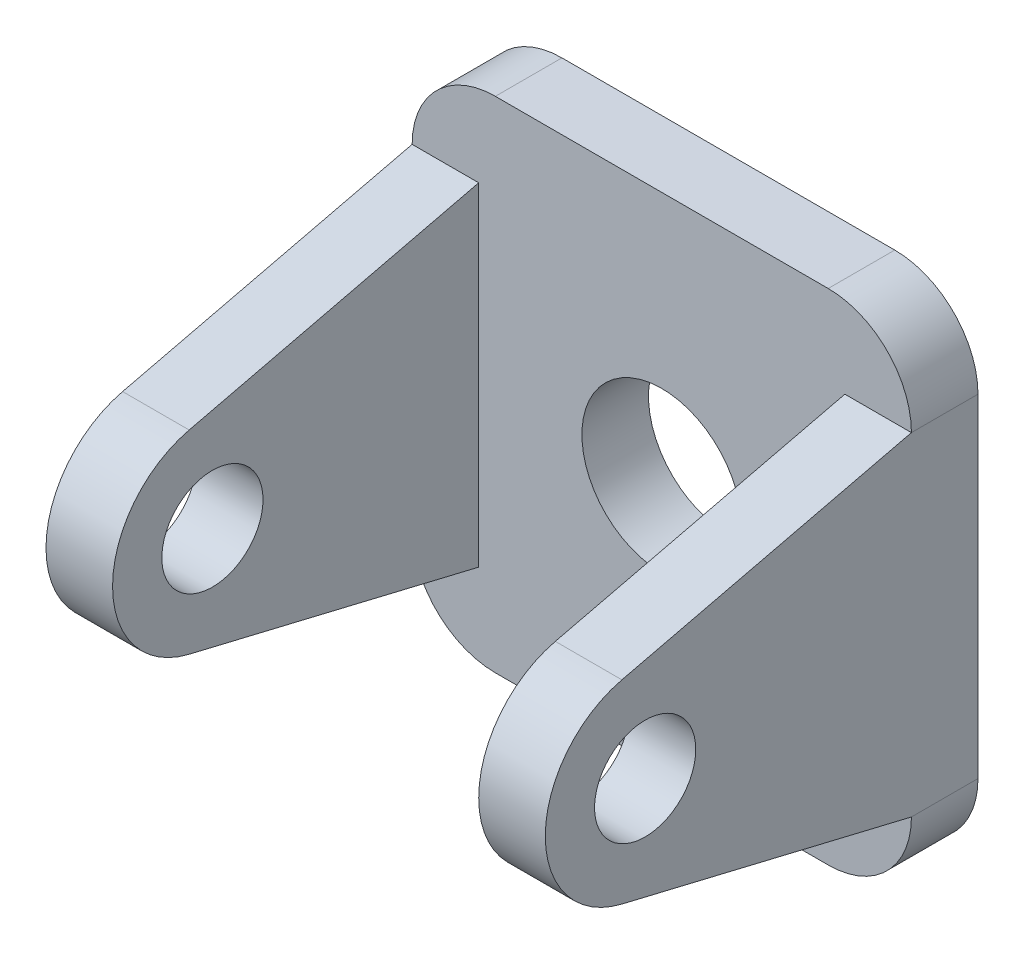
ISO-10303-21;
HEADER;
FILE_DESCRIPTION(('STEP AP214'),'2;1');
FILE_NAME('part.step','',(''),(''),'','','');
FILE_SCHEMA(('AUTOMOTIVE_DESIGN { 1 0 10303 214 1 1 1 1 }'));
ENDSEC;
DATA;
#1=APPLICATION_CONTEXT('core data for automotive mechanical design processes');
#2=APPLICATION_PROTOCOL_DEFINITION('international standard','automotive_design',2000,#1);
#3=PRODUCT_CONTEXT('',#1,'mechanical');
#4=PRODUCT('Part','Part','',(#3));
#5=PRODUCT_RELATED_PRODUCT_CATEGORY('part','',(#4));
#6=PRODUCT_DEFINITION_FORMATION('','',#4);
#7=PRODUCT_DEFINITION_CONTEXT('part definition',#1,'design');
#8=PRODUCT_DEFINITION('design','',#6,#7);
#9=PRODUCT_DEFINITION_SHAPE('','',#8);
#10=(LENGTH_UNIT() NAMED_UNIT(*) SI_UNIT(.MILLI.,.METRE.));
#11=(NAMED_UNIT(*) PLANE_ANGLE_UNIT() SI_UNIT($,.RADIAN.));
#12=(NAMED_UNIT(*) SI_UNIT($,.STERADIAN.) SOLID_ANGLE_UNIT());
#13=UNCERTAINTY_MEASURE_WITH_UNIT(LENGTH_MEASURE(1.E-05),#10,'distance_accuracy_value','');
#14=(GEOMETRIC_REPRESENTATION_CONTEXT(3) GLOBAL_UNCERTAINTY_ASSIGNED_CONTEXT((#13)) GLOBAL_UNIT_ASSIGNED_CONTEXT((#10,
#11,#12)) REPRESENTATION_CONTEXT('',''));
#15=CARTESIAN_POINT('',(0.,0.,0.));
#16=DIRECTION('',(0.,0.,1.));
#17=DIRECTION('',(1.,0.,0.));
#18=AXIS2_PLACEMENT_3D('',#15,#16,#17);
#19=CARTESIAN_POINT('',(25.,-25.,10.));
#20=DIRECTION('',(0.,0.,-1.));
#21=DIRECTION('',(-1.,0.,0.));
#22=AXIS2_PLACEMENT_3D('',#19,#20,#21);
#23=PLANE('',#22);
#24=CARTESIAN_POINT('',(0.,0.,10.));
#25=DIRECTION('',(0.,0.,1.));
#26=DIRECTION('',(1.,0.,0.));
#27=AXIS2_PLACEMENT_3D('',#24,#25,#26);
#28=CIRCLE('',#27,12.);
#29=CARTESIAN_POINT('',(12.,0.,10.));
#30=VERTEX_POINT('',#29);
#31=EDGE_CURVE('E577',#30,#30,#28,.T.);
#32=ORIENTED_EDGE('',*,*,#31,.F.);
#33=EDGE_LOOP('',(#32));
#34=FACE_BOUND('',#33,.T.);
#35=DIRECTION('',(-1.,0.,0.));
#36=VECTOR('',#35,1.);
#37=CARTESIAN_POINT('',(-27.5,24.9999999999999,10.));
#38=LINE('',#37,#36);
#39=CARTESIAN_POINT('',(-27.5,24.9999999999999,10.));
#40=VERTEX_POINT('',#39);
#41=CARTESIAN_POINT('',(-37.5,24.9999999999999,10.));
#42=VERTEX_POINT('',#41);
#43=EDGE_CURVE('E60',#40,#42,#38,.T.);
#44=ORIENTED_EDGE('',*,*,#43,.F.);
#45=DIRECTION('',(0.,-1.,0.));
#46=VECTOR('',#45,1.);
#47=CARTESIAN_POINT('',(-27.5,0.,10.));
#48=LINE('',#47,#46);
#49=CARTESIAN_POINT('',(-27.5,-24.9999999999999,10.));
#50=VERTEX_POINT('',#49);
#51=EDGE_CURVE('E65',#40,#50,#48,.T.);
#52=ORIENTED_EDGE('',*,*,#51,.T.);
#53=DIRECTION('',(-1.,0.,0.));
#54=VECTOR('',#53,1.);
#55=CARTESIAN_POINT('',(-27.5,-24.9999999999999,10.));
#56=LINE('',#55,#54);
#57=CARTESIAN_POINT('',(-37.5,-24.9999999999999,10.));
#58=VERTEX_POINT('',#57);
#59=EDGE_CURVE('E168',#50,#58,#56,.T.);
#60=ORIENTED_EDGE('',*,*,#59,.T.);
#61=CARTESIAN_POINT('',(-25.,-25.,10.));
#62=DIRECTION('',(0.,0.,1.));
#63=DIRECTION('',(-1.,0.,0.));
#64=AXIS2_PLACEMENT_3D('',#61,#62,#63);
#65=CIRCLE('',#64,12.5);
#66=CARTESIAN_POINT('',(-24.9999999999999,-37.5,10.));
#67=VERTEX_POINT('',#66);
#68=EDGE_CURVE('E262',#58,#67,#65,.T.);
#69=ORIENTED_EDGE('',*,*,#68,.T.);
#70=DIRECTION('',(1.,0.,0.));
#71=VECTOR('',#70,1.);
#72=CARTESIAN_POINT('',(24.9999999999999,-37.5,10.));
#73=LINE('',#72,#71);
#74=CARTESIAN_POINT('',(24.9999999999999,-37.5,10.));
#75=VERTEX_POINT('',#74);
#76=EDGE_CURVE('E265',#67,#75,#73,.T.);
#77=ORIENTED_EDGE('',*,*,#76,.T.);
#78=CARTESIAN_POINT('',(25.,-25.,10.));
#79=DIRECTION('',(0.,0.,1.));
#80=DIRECTION('',(-1.,0.,0.));
#81=AXIS2_PLACEMENT_3D('',#78,#79,#80);
#82=CIRCLE('',#81,12.5);
#83=CARTESIAN_POINT('',(37.5,-24.9999999999999,10.));
#84=VERTEX_POINT('',#83);
#85=EDGE_CURVE('E248',#75,#84,#82,.T.);
#86=ORIENTED_EDGE('',*,*,#85,.T.);
#87=DIRECTION('',(1.,0.,0.));
#88=VECTOR('',#87,1.);
#89=CARTESIAN_POINT('',(27.5,-24.9999999999999,10.));
#90=LINE('',#89,#88);
#91=CARTESIAN_POINT('',(27.5,-24.9999999999999,10.));
#92=VERTEX_POINT('',#91);
#93=EDGE_CURVE('E240',#92,#84,#90,.T.);
#94=ORIENTED_EDGE('',*,*,#93,.F.);
#95=DIRECTION('',(0.,-1.,0.));
#96=VECTOR('',#95,1.);
#97=CARTESIAN_POINT('',(27.5,0.,10.));
#98=LINE('',#97,#96);
#99=CARTESIAN_POINT('',(27.5,24.9999999999999,10.));
#100=VERTEX_POINT('',#99);
#101=EDGE_CURVE('E213',#100,#92,#98,.T.);
#102=ORIENTED_EDGE('',*,*,#101,.F.);
#103=DIRECTION('',(1.,0.,0.));
#104=VECTOR('',#103,1.);
#105=CARTESIAN_POINT('',(27.5,24.9999999999999,10.));
#106=LINE('',#105,#104);
#107=CARTESIAN_POINT('',(37.5,24.9999999999999,10.));
#108=VERTEX_POINT('',#107);
#109=EDGE_CURVE('E235',#100,#108,#106,.T.);
#110=ORIENTED_EDGE('',*,*,#109,.T.);
#111=CARTESIAN_POINT('',(25.,25.,10.));
#112=DIRECTION('',(0.,0.,1.));
#113=DIRECTION('',(1.,0.,0.));
#114=AXIS2_PLACEMENT_3D('',#111,#112,#113);
#115=CIRCLE('',#114,12.5);
#116=CARTESIAN_POINT('',(24.9999999999999,37.5,10.));
#117=VERTEX_POINT('',#116);
#118=EDGE_CURVE('E252',#108,#117,#115,.T.);
#119=ORIENTED_EDGE('',*,*,#118,.T.);
#120=DIRECTION('',(-1.,0.,0.));
#121=VECTOR('',#120,1.);
#122=CARTESIAN_POINT('',(24.9999999999999,37.5,10.));
#123=LINE('',#122,#121);
#124=CARTESIAN_POINT('',(-24.9999999999999,37.5,10.));
#125=VERTEX_POINT('',#124);
#126=EDGE_CURVE('E256',#117,#125,#123,.T.);
#127=ORIENTED_EDGE('',*,*,#126,.T.);
#128=CARTESIAN_POINT('',(-25.,25.,10.));
#129=DIRECTION('',(0.,0.,1.));
#130=DIRECTION('',(-1.,0.,0.));
#131=AXIS2_PLACEMENT_3D('',#128,#129,#130);
#132=CIRCLE('',#131,12.5);
#133=EDGE_CURVE('E259',#125,#42,#132,.T.);
#134=ORIENTED_EDGE('',*,*,#133,.T.);
#135=EDGE_LOOP('',(#44,#52,#60,#69,#77,#86,#94,#102,#110,#119,#127,#134));
#136=FACE_BOUND('',#135,.T.);
#137=ADVANCED_FACE('F44',(#34,#136),#23,.F.);
#138=CARTESIAN_POINT('',(25.,-25.,10.));
#139=DIRECTION('',(0.,0.,-1.));
#140=DIRECTION('',(-1.,0.,0.));
#141=AXIS2_PLACEMENT_3D('',#138,#139,#140);
#142=CYLINDRICAL_SURFACE('',#141,12.5);
#143=CARTESIAN_POINT('',(25.,-25.,0.));
#144=DIRECTION('',(0.,0.,1.));
#145=DIRECTION('',(-1.,0.,0.));
#146=AXIS2_PLACEMENT_3D('',#143,#144,#145);
#147=CIRCLE('',#146,12.5);
#148=CARTESIAN_POINT('',(24.9999999999999,-37.5,0.));
#149=VERTEX_POINT('',#148);
#150=CARTESIAN_POINT('',(37.5,-24.9999999999999,0.));
#151=VERTEX_POINT('',#150);
#152=EDGE_CURVE('E239',#149,#151,#147,.T.);
#153=ORIENTED_EDGE('',*,*,#152,.T.);
#154=DIRECTION('',(0.,0.,-1.));
#155=VECTOR('',#154,1.);
#156=CARTESIAN_POINT('',(37.5,-24.9999999999999,10.));
#157=LINE('',#156,#155);
#158=EDGE_CURVE('E11',#84,#151,#157,.T.);
#159=ORIENTED_EDGE('',*,*,#158,.F.);
#160=ORIENTED_EDGE('',*,*,#85,.F.);
#161=DIRECTION('',(0.,0.,-1.));
#162=VECTOR('',#161,1.);
#163=CARTESIAN_POINT('',(24.9999999999999,-37.5,10.));
#164=LINE('',#163,#162);
#165=EDGE_CURVE('E268',#75,#149,#164,.T.);
#166=ORIENTED_EDGE('',*,*,#165,.T.);
#167=EDGE_LOOP('',(#153,#159,#160,#166));
#168=FACE_BOUND('',#167,.T.);
#169=ADVANCED_FACE('F46',(#168),#142,.T.);
#170=CARTESIAN_POINT('',(37.5,-24.9999999999999,10.));
#171=DIRECTION('',(-1.,0.,0.));
#172=DIRECTION('',(0.,0.,1.));
#173=AXIS2_PLACEMENT_3D('',#170,#171,#172);
#174=PLANE('',#173);
#175=DIRECTION('',(0.,1.,0.));
#176=VECTOR('',#175,1.);
#177=CARTESIAN_POINT('',(37.5,-24.9999999999999,0.));
#178=LINE('',#177,#176);
#179=CARTESIAN_POINT('',(37.5,24.9999999999999,0.));
#180=VERTEX_POINT('',#179);
#181=EDGE_CURVE('E272',#151,#180,#178,.T.);
#182=ORIENTED_EDGE('',*,*,#181,.T.);
#183=DIRECTION('',(0.,0.,-1.));
#184=VECTOR('',#183,1.);
#185=CARTESIAN_POINT('',(37.5,24.9999999999999,10.));
#186=LINE('',#185,#184);
#187=EDGE_CURVE('E53',#108,#180,#186,.T.);
#188=ORIENTED_EDGE('',*,*,#187,.F.);
#189=DIRECTION('',(0.,-0.232824264606692,0.972518823370711));
#190=VECTOR('',#189,1.);
#191=CARTESIAN_POINT('',(37.5,25.9090813439333,6.20272087858274));
#192=LINE('',#191,#190);
#193=CARTESIAN_POINT('',(37.5,14.5877823505607,53.4923639691004));
#194=VERTEX_POINT('',#193);
#195=EDGE_CURVE('E195',#108,#194,#192,.T.);
#196=ORIENTED_EDGE('',*,*,#195,.T.);
#197=CARTESIAN_POINT('',(37.5,0.,50.));
#198=DIRECTION('',(1.,0.,0.));
#199=DIRECTION('',(0.,0.,-1.));
#200=AXIS2_PLACEMENT_3D('',#197,#198,#199);
#201=CIRCLE('',#200,15.);
#202=CARTESIAN_POINT('',(37.5,-14.5877823505607,53.4923639691004));
#203=VERTEX_POINT('',#202);
#204=EDGE_CURVE('E224',#194,#203,#201,.T.);
#205=ORIENTED_EDGE('',*,*,#204,.T.);
#206=DIRECTION('',(0.,0.232824264606693,0.972518823370711));
#207=VECTOR('',#206,1.);
#208=CARTESIAN_POINT('',(37.5,-25.9090813439333,6.20272087858275));
#209=LINE('',#208,#207);
#210=EDGE_CURVE('E228',#84,#203,#209,.T.);
#211=ORIENTED_EDGE('',*,*,#210,.F.);
#212=ORIENTED_EDGE('',*,*,#158,.T.);
#213=EDGE_LOOP('',(#182,#188,#196,#205,#211,#212));
#214=FACE_BOUND('',#213,.T.);
#215=CARTESIAN_POINT('',(37.5,0.,50.));
#216=DIRECTION('',(1.,0.,0.));
#217=DIRECTION('',(0.,0.,-1.));
#218=AXIS2_PLACEMENT_3D('',#215,#216,#217);
#219=CIRCLE('',#218,7.6);
#220=CARTESIAN_POINT('',(37.5,0.,42.4));
#221=VERTEX_POINT('',#220);
#222=EDGE_CURVE('E206',#221,#221,#219,.T.);
#223=ORIENTED_EDGE('',*,*,#222,.F.);
#224=EDGE_LOOP('',(#223));
#225=FACE_BOUND('',#224,.T.);
#226=ADVANCED_FACE('F352',(#214,#225),#174,.F.);
#227=CARTESIAN_POINT('',(25.,25.,10.));
#228=DIRECTION('',(0.,0.,-1.));
#229=DIRECTION('',(-1.,0.,0.));
#230=AXIS2_PLACEMENT_3D('',#227,#228,#229);
#231=CYLINDRICAL_SURFACE('',#230,12.5);
#232=CARTESIAN_POINT('',(25.,25.,0.));
#233=DIRECTION('',(0.,0.,1.));
#234=DIRECTION('',(1.,0.,0.));
#235=AXIS2_PLACEMENT_3D('',#232,#233,#234);
#236=CIRCLE('',#235,12.5);
#237=CARTESIAN_POINT('',(24.9999999999999,37.5,0.));
#238=VERTEX_POINT('',#237);
#239=EDGE_CURVE('E275',#180,#238,#236,.T.);
#240=ORIENTED_EDGE('',*,*,#239,.T.);
#241=DIRECTION('',(0.,0.,-1.));
#242=VECTOR('',#241,1.);
#243=CARTESIAN_POINT('',(24.9999999999999,37.5,10.));
#244=LINE('',#243,#242);
#245=EDGE_CURVE('E311',#117,#238,#244,.T.);
#246=ORIENTED_EDGE('',*,*,#245,.F.);
#247=ORIENTED_EDGE('',*,*,#118,.F.);
#248=ORIENTED_EDGE('',*,*,#187,.T.);
#249=EDGE_LOOP('',(#240,#246,#247,#248));
#250=FACE_BOUND('',#249,.T.);
#251=ADVANCED_FACE('F320',(#250),#231,.T.);
#252=CARTESIAN_POINT('',(24.9999999999999,37.5,10.));
#253=DIRECTION('',(0.,-1.,0.));
#254=DIRECTION('',(0.,0.,-1.));
#255=AXIS2_PLACEMENT_3D('',#252,#253,#254);
#256=PLANE('',#255);
#257=DIRECTION('',(-1.,0.,0.));
#258=VECTOR('',#257,1.);
#259=CARTESIAN_POINT('',(24.9999999999999,37.5,0.));
#260=LINE('',#259,#258);
#261=CARTESIAN_POINT('',(-24.9999999999999,37.5,0.));
#262=VERTEX_POINT('',#261);
#263=EDGE_CURVE('E278',#238,#262,#260,.T.);
#264=ORIENTED_EDGE('',*,*,#263,.T.);
#265=DIRECTION('',(0.,0.,-1.));
#266=VECTOR('',#265,1.);
#267=CARTESIAN_POINT('',(-24.9999999999999,37.5,10.));
#268=LINE('',#267,#266);
#269=EDGE_CURVE('E307',#125,#262,#268,.T.);
#270=ORIENTED_EDGE('',*,*,#269,.F.);
#271=ORIENTED_EDGE('',*,*,#126,.F.);
#272=ORIENTED_EDGE('',*,*,#245,.T.);
#273=EDGE_LOOP('',(#264,#270,#271,#272));
#274=FACE_BOUND('',#273,.T.);
#275=ADVANCED_FACE('F331',(#274),#256,.F.);
#276=CARTESIAN_POINT('',(-25.,25.,10.));
#277=DIRECTION('',(0.,0.,-1.));
#278=DIRECTION('',(-1.,0.,0.));
#279=AXIS2_PLACEMENT_3D('',#276,#277,#278);
#280=CYLINDRICAL_SURFACE('',#279,12.5);
#281=CARTESIAN_POINT('',(-25.,25.,0.));
#282=DIRECTION('',(0.,0.,1.));
#283=DIRECTION('',(-1.,0.,0.));
#284=AXIS2_PLACEMENT_3D('',#281,#282,#283);
#285=CIRCLE('',#284,12.5);
#286=CARTESIAN_POINT('',(-37.5,24.9999999999999,0.));
#287=VERTEX_POINT('',#286);
#288=EDGE_CURVE('E281',#262,#287,#285,.T.);
#289=ORIENTED_EDGE('',*,*,#288,.T.);
#290=DIRECTION('',(0.,0.,-1.));
#291=VECTOR('',#290,1.);
#292=CARTESIAN_POINT('',(-37.5,24.9999999999999,10.));
#293=LINE('',#292,#291);
#294=EDGE_CURVE('E303',#42,#287,#293,.T.);
#295=ORIENTED_EDGE('',*,*,#294,.F.);
#296=ORIENTED_EDGE('',*,*,#133,.F.);
#297=ORIENTED_EDGE('',*,*,#269,.T.);
#298=EDGE_LOOP('',(#289,#295,#296,#297));
#299=FACE_BOUND('',#298,.T.);
#300=ADVANCED_FACE('F335',(#299),#280,.T.);
#301=CARTESIAN_POINT('',(-37.5,-24.9999999999999,10.));
#302=DIRECTION('',(1.,0.,0.));
#303=DIRECTION('',(0.,0.,-1.));
#304=AXIS2_PLACEMENT_3D('',#301,#302,#303);
#305=PLANE('',#304);
#306=DIRECTION('',(0.,-1.,0.));
#307=VECTOR('',#306,1.);
#308=CARTESIAN_POINT('',(-37.5,-24.9999999999999,0.));
#309=LINE('',#308,#307);
#310=CARTESIAN_POINT('',(-37.5,-24.9999999999999,0.));
#311=VERTEX_POINT('',#310);
#312=EDGE_CURVE('E284',#287,#311,#309,.T.);
#313=ORIENTED_EDGE('',*,*,#312,.T.);
#314=DIRECTION('',(0.,0.,-1.));
#315=VECTOR('',#314,1.);
#316=CARTESIAN_POINT('',(-37.5,-24.9999999999999,10.));
#317=LINE('',#316,#315);
#318=EDGE_CURVE('E299',#58,#311,#317,.T.);
#319=ORIENTED_EDGE('',*,*,#318,.F.);
#320=DIRECTION('',(0.,0.232824264606693,0.972518823370711));
#321=VECTOR('',#320,1.);
#322=CARTESIAN_POINT('',(-37.5,-25.9090813439333,6.20272087858275));
#323=LINE('',#322,#321);
#324=CARTESIAN_POINT('',(-37.5,-14.5877823505607,53.4923639691004));
#325=VERTEX_POINT('',#324);
#326=EDGE_CURVE('E184',#58,#325,#323,.T.);
#327=ORIENTED_EDGE('',*,*,#326,.T.);
#328=CARTESIAN_POINT('',(-37.5,0.,50.));
#329=DIRECTION('',(1.,0.,0.));
#330=DIRECTION('',(0.,0.,-1.));
#331=AXIS2_PLACEMENT_3D('',#328,#329,#330);
#332=CIRCLE('',#331,15.);
#333=CARTESIAN_POINT('',(-37.5,14.5877823505607,53.4923639691004));
#334=VERTEX_POINT('',#333);
#335=EDGE_CURVE('E162',#334,#325,#332,.T.);
#336=ORIENTED_EDGE('',*,*,#335,.F.);
#337=DIRECTION('',(0.,-0.232824264606692,0.972518823370711));
#338=VECTOR('',#337,1.);
#339=CARTESIAN_POINT('',(-37.5,25.9090813439333,6.20272087858274));
#340=LINE('',#339,#338);
#341=EDGE_CURVE('E180',#42,#334,#340,.T.);
#342=ORIENTED_EDGE('',*,*,#341,.F.);
#343=ORIENTED_EDGE('',*,*,#294,.T.);
#344=EDGE_LOOP('',(#313,#319,#327,#336,#342,#343));
#345=FACE_BOUND('',#344,.T.);
#346=CARTESIAN_POINT('',(-37.5,0.,50.));
#347=DIRECTION('',(1.,0.,0.));
#348=DIRECTION('',(0.,0.,-1.));
#349=AXIS2_PLACEMENT_3D('',#346,#347,#348);
#350=CIRCLE('',#349,7.6);
#351=CARTESIAN_POINT('',(-37.5,0.,42.4));
#352=VERTEX_POINT('',#351);
#353=EDGE_CURVE('E190',#352,#352,#350,.T.);
#354=ORIENTED_EDGE('',*,*,#353,.T.);
#355=EDGE_LOOP('',(#354));
#356=FACE_BOUND('',#355,.T.);
#357=ADVANCED_FACE('F392',(#345,#356),#305,.F.);
#358=CARTESIAN_POINT('',(-25.,-25.,10.));
#359=DIRECTION('',(0.,0.,-1.));
#360=DIRECTION('',(-1.,0.,0.));
#361=AXIS2_PLACEMENT_3D('',#358,#359,#360);
#362=CYLINDRICAL_SURFACE('',#361,12.5);
#363=CARTESIAN_POINT('',(-25.,-25.,0.));
#364=DIRECTION('',(0.,0.,1.));
#365=DIRECTION('',(-1.,0.,0.));
#366=AXIS2_PLACEMENT_3D('',#363,#364,#365);
#367=CIRCLE('',#366,12.5);
#368=CARTESIAN_POINT('',(-24.9999999999999,-37.5,0.));
#369=VERTEX_POINT('',#368);
#370=EDGE_CURVE('E287',#311,#369,#367,.T.);
#371=ORIENTED_EDGE('',*,*,#370,.T.);
#372=DIRECTION('',(0.,0.,-1.));
#373=VECTOR('',#372,1.);
#374=CARTESIAN_POINT('',(-24.9999999999999,-37.5,10.));
#375=LINE('',#374,#373);
#376=EDGE_CURVE('E295',#67,#369,#375,.T.);
#377=ORIENTED_EDGE('',*,*,#376,.F.);
#378=ORIENTED_EDGE('',*,*,#68,.F.);
#379=ORIENTED_EDGE('',*,*,#318,.T.);
#380=EDGE_LOOP('',(#371,#377,#378,#379));
#381=FACE_BOUND('',#380,.T.);
#382=ADVANCED_FACE('F388',(#381),#362,.T.);
#383=CARTESIAN_POINT('',(24.9999999999999,-37.5,10.));
#384=DIRECTION('',(0.,1.,0.));
#385=DIRECTION('',(0.,0.,1.));
#386=AXIS2_PLACEMENT_3D('',#383,#384,#385);
#387=PLANE('',#386);
#388=DIRECTION('',(1.,0.,0.));
#389=VECTOR('',#388,1.);
#390=CARTESIAN_POINT('',(24.9999999999999,-37.5,0.));
#391=LINE('',#390,#389);
#392=EDGE_CURVE('E253',#369,#149,#391,.T.);
#393=ORIENTED_EDGE('',*,*,#392,.T.);
#394=ORIENTED_EDGE('',*,*,#165,.F.);
#395=ORIENTED_EDGE('',*,*,#76,.F.);
#396=ORIENTED_EDGE('',*,*,#376,.T.);
#397=EDGE_LOOP('',(#393,#394,#395,#396));
#398=FACE_BOUND('',#397,.T.);
#399=ADVANCED_FACE('F384',(#398),#387,.F.);
#400=CARTESIAN_POINT('',(25.,-25.,0.));
#401=DIRECTION('',(0.,0.,-1.));
#402=DIRECTION('',(-1.,0.,0.));
#403=AXIS2_PLACEMENT_3D('',#400,#401,#402);
#404=PLANE('',#403);
#405=CARTESIAN_POINT('',(0.,0.,0.));
#406=DIRECTION('',(0.,0.,1.));
#407=DIRECTION('',(1.,0.,0.));
#408=AXIS2_PLACEMENT_3D('',#405,#406,#407);
#409=CIRCLE('',#408,12.);
#410=CARTESIAN_POINT('',(12.,0.,0.));
#411=VERTEX_POINT('',#410);
#412=EDGE_CURVE('E185',#411,#411,#409,.T.);
#413=ORIENTED_EDGE('',*,*,#412,.T.);
#414=EDGE_LOOP('',(#413));
#415=FACE_BOUND('',#414,.T.);
#416=ORIENTED_EDGE('',*,*,#152,.F.);
#417=ORIENTED_EDGE('',*,*,#392,.F.);
#418=ORIENTED_EDGE('',*,*,#370,.F.);
#419=ORIENTED_EDGE('',*,*,#312,.F.);
#420=ORIENTED_EDGE('',*,*,#288,.F.);
#421=ORIENTED_EDGE('',*,*,#263,.F.);
#422=ORIENTED_EDGE('',*,*,#239,.F.);
#423=ORIENTED_EDGE('',*,*,#181,.F.);
#424=EDGE_LOOP('',(#416,#417,#418,#419,#420,#421,#422,#423));
#425=FACE_BOUND('',#424,.T.);
#426=ADVANCED_FACE('F326',(#415,#425),#404,.T.);
#427=CARTESIAN_POINT('',(27.5,25.9090813439333,6.20272087858274));
#428=DIRECTION('',(0.,0.972518823370711,0.232824264606692));
#429=DIRECTION('',(0.,-0.232824264606692,0.972518823370711));
#430=AXIS2_PLACEMENT_3D('',#427,#428,#429);
#431=PLANE('',#430);
#432=ORIENTED_EDGE('',*,*,#195,.F.);
#433=ORIENTED_EDGE('',*,*,#109,.F.);
#434=DIRECTION('',(0.,-0.232824264606692,0.972518823370711));
#435=VECTOR('',#434,1.);
#436=CARTESIAN_POINT('',(27.5,25.9090813439333,6.20272087858274));
#437=LINE('',#436,#435);
#438=CARTESIAN_POINT('',(27.5,14.5877823505607,53.4923639691004));
#439=VERTEX_POINT('',#438);
#440=EDGE_CURVE('E201',#100,#439,#437,.T.);
#441=ORIENTED_EDGE('',*,*,#440,.T.);
#442=DIRECTION('',(1.,0.,0.));
#443=VECTOR('',#442,1.);
#444=CARTESIAN_POINT('',(27.5,14.5877823505607,53.4923639691004));
#445=LINE('',#444,#443);
#446=EDGE_CURVE('E220',#439,#194,#445,.T.);
#447=ORIENTED_EDGE('',*,*,#446,.T.);
#448=EDGE_LOOP('',(#432,#433,#441,#447));
#449=FACE_BOUND('',#448,.T.);
#450=ADVANCED_FACE('F341',(#449),#431,.T.);
#451=CARTESIAN_POINT('',(27.5,-25.9090813439333,6.20272087858275));
#452=DIRECTION('',(0.,0.972518823370711,-0.232824264606693));
#453=DIRECTION('',(0.,0.232824264606693,0.972518823370711));
#454=AXIS2_PLACEMENT_3D('',#451,#452,#453);
#455=PLANE('',#454);
#456=ORIENTED_EDGE('',*,*,#210,.T.);
#457=DIRECTION('',(1.,0.,0.));
#458=VECTOR('',#457,1.);
#459=CARTESIAN_POINT('',(27.5,-14.5877823505607,53.4923639691004));
#460=LINE('',#459,#458);
#461=CARTESIAN_POINT('',(27.5,-14.5877823505607,53.4923639691004));
#462=VERTEX_POINT('',#461);
#463=EDGE_CURVE('E243',#462,#203,#460,.T.);
#464=ORIENTED_EDGE('',*,*,#463,.F.);
#465=DIRECTION('',(0.,0.232824264606693,0.972518823370711));
#466=VECTOR('',#465,1.);
#467=CARTESIAN_POINT('',(27.5,-25.9090813439333,6.20272087858275));
#468=LINE('',#467,#466);
#469=EDGE_CURVE('E210',#92,#462,#468,.T.);
#470=ORIENTED_EDGE('',*,*,#469,.F.);
#471=ORIENTED_EDGE('',*,*,#93,.T.);
#472=EDGE_LOOP('',(#456,#464,#470,#471));
#473=FACE_BOUND('',#472,.T.);
#474=ADVANCED_FACE('F367',(#473),#455,.F.);
#475=CARTESIAN_POINT('',(27.5,0.,50.));
#476=DIRECTION('',(1.,0.,0.));
#477=DIRECTION('',(0.,0.,-1.));
#478=AXIS2_PLACEMENT_3D('',#475,#476,#477);
#479=CYLINDRICAL_SURFACE('',#478,15.);
#480=ORIENTED_EDGE('',*,*,#204,.F.);
#481=ORIENTED_EDGE('',*,*,#446,.F.);
#482=CARTESIAN_POINT('',(27.5,0.,50.));
#483=DIRECTION('',(1.,0.,0.));
#484=DIRECTION('',(0.,0.,-1.));
#485=AXIS2_PLACEMENT_3D('',#482,#483,#484);
#486=CIRCLE('',#485,15.);
#487=EDGE_CURVE('E205',#439,#462,#486,.T.);
#488=ORIENTED_EDGE('',*,*,#487,.T.);
#489=ORIENTED_EDGE('',*,*,#463,.T.);
#490=EDGE_LOOP('',(#480,#481,#488,#489));
#491=FACE_BOUND('',#490,.T.);
#492=ADVANCED_FACE('F350',(#491),#479,.T.);
#493=CARTESIAN_POINT('',(27.5,0.,50.));
#494=DIRECTION('',(1.,0.,0.));
#495=DIRECTION('',(0.,0.,-1.));
#496=AXIS2_PLACEMENT_3D('',#493,#494,#495);
#497=CYLINDRICAL_SURFACE('',#496,7.6);
#498=CARTESIAN_POINT('',(27.5,0.,50.));
#499=DIRECTION('',(1.,0.,0.));
#500=DIRECTION('',(0.,0.,-1.));
#501=AXIS2_PLACEMENT_3D('',#498,#499,#500);
#502=CIRCLE('',#501,7.6);
#503=CARTESIAN_POINT('',(27.5,0.,42.4));
#504=VERTEX_POINT('',#503);
#505=EDGE_CURVE('E216',#504,#504,#502,.T.);
#506=ORIENTED_EDGE('',*,*,#505,.F.);
#507=EDGE_LOOP('',(#506));
#508=FACE_BOUND('',#507,.T.);
#509=ORIENTED_EDGE('',*,*,#222,.T.);
#510=EDGE_LOOP('',(#509));
#511=FACE_BOUND('',#510,.T.);
#512=ADVANCED_FACE('F357',(#508,#511),#497,.F.);
#513=CARTESIAN_POINT('',(27.5,0.,0.));
#514=DIRECTION('',(1.,0.,0.));
#515=DIRECTION('',(0.,0.,-1.));
#516=AXIS2_PLACEMENT_3D('',#513,#514,#515);
#517=PLANE('',#516);
#518=ORIENTED_EDGE('',*,*,#440,.F.);
#519=ORIENTED_EDGE('',*,*,#101,.T.);
#520=ORIENTED_EDGE('',*,*,#469,.T.);
#521=ORIENTED_EDGE('',*,*,#487,.F.);
#522=EDGE_LOOP('',(#518,#519,#520,#521));
#523=FACE_BOUND('',#522,.T.);
#524=ORIENTED_EDGE('',*,*,#505,.T.);
#525=EDGE_LOOP('',(#524));
#526=FACE_BOUND('',#525,.T.);
#527=ADVANCED_FACE('F344',(#523,#526),#517,.F.);
#528=CARTESIAN_POINT('',(-27.5,25.9090813439333,6.20272087858274));
#529=DIRECTION('',(0.,-0.972518823370711,-0.232824264606692));
#530=DIRECTION('',(0.,0.232824264606692,-0.972518823370711));
#531=AXIS2_PLACEMENT_3D('',#528,#529,#530);
#532=PLANE('',#531);
#533=ORIENTED_EDGE('',*,*,#341,.T.);
#534=DIRECTION('',(-1.,0.,0.));
#535=VECTOR('',#534,1.);
#536=CARTESIAN_POINT('',(-27.5,14.5877823505607,53.4923639691004));
#537=LINE('',#536,#535);
#538=CARTESIAN_POINT('',(-27.5,14.5877823505607,53.4923639691004));
#539=VERTEX_POINT('',#538);
#540=EDGE_CURVE('E167',#539,#334,#537,.T.);
#541=ORIENTED_EDGE('',*,*,#540,.F.);
#542=DIRECTION('',(0.,-0.232824264606692,0.972518823370711));
#543=VECTOR('',#542,1.);
#544=CARTESIAN_POINT('',(-27.5,25.9090813439333,6.20272087858274));
#545=LINE('',#544,#543);
#546=EDGE_CURVE('E152',#40,#539,#545,.T.);
#547=ORIENTED_EDGE('',*,*,#546,.F.);
#548=ORIENTED_EDGE('',*,*,#43,.T.);
#549=EDGE_LOOP('',(#533,#541,#547,#548));
#550=FACE_BOUND('',#549,.T.);
#551=ADVANCED_FACE('F365',(#550),#532,.F.);
#552=CARTESIAN_POINT('',(-27.5,0.,50.));
#553=DIRECTION('',(-1.,0.,0.));
#554=DIRECTION('',(0.,0.,1.));
#555=AXIS2_PLACEMENT_3D('',#552,#553,#554);
#556=CYLINDRICAL_SURFACE('',#555,15.);
#557=ORIENTED_EDGE('',*,*,#335,.T.);
#558=DIRECTION('',(-1.,0.,0.));
#559=VECTOR('',#558,1.);
#560=CARTESIAN_POINT('',(-27.5,-14.5877823505607,53.4923639691004));
#561=LINE('',#560,#559);
#562=CARTESIAN_POINT('',(-27.5,-14.5877823505607,53.4923639691004));
#563=VERTEX_POINT('',#562);
#564=EDGE_CURVE('E160',#563,#325,#561,.T.);
#565=ORIENTED_EDGE('',*,*,#564,.F.);
#566=CARTESIAN_POINT('',(-27.5,0.,50.));
#567=DIRECTION('',(1.,0.,0.));
#568=DIRECTION('',(0.,0.,-1.));
#569=AXIS2_PLACEMENT_3D('',#566,#567,#568);
#570=CIRCLE('',#569,15.);
#571=EDGE_CURVE('E146',#539,#563,#570,.T.);
#572=ORIENTED_EDGE('',*,*,#571,.F.);
#573=ORIENTED_EDGE('',*,*,#540,.T.);
#574=EDGE_LOOP('',(#557,#565,#572,#573));
#575=FACE_BOUND('',#574,.T.);
#576=ADVANCED_FACE('F161',(#575),#556,.T.);
#577=CARTESIAN_POINT('',(-27.5,-25.9090813439333,6.20272087858275));
#578=DIRECTION('',(0.,-0.972518823370711,0.232824264606693));
#579=DIRECTION('',(0.,-0.232824264606693,-0.972518823370711));
#580=AXIS2_PLACEMENT_3D('',#577,#578,#579);
#581=PLANE('',#580);
#582=ORIENTED_EDGE('',*,*,#326,.F.);
#583=ORIENTED_EDGE('',*,*,#59,.F.);
#584=DIRECTION('',(0.,0.232824264606693,0.972518823370711));
#585=VECTOR('',#584,1.);
#586=CARTESIAN_POINT('',(-27.5,-25.9090813439333,6.20272087858275));
#587=LINE('',#586,#585);
#588=EDGE_CURVE('E151',#50,#563,#587,.T.);
#589=ORIENTED_EDGE('',*,*,#588,.T.);
#590=ORIENTED_EDGE('',*,*,#564,.T.);
#591=EDGE_LOOP('',(#582,#583,#589,#590));
#592=FACE_BOUND('',#591,.T.);
#593=ADVANCED_FACE('F170',(#592),#581,.T.);
#594=CARTESIAN_POINT('',(-27.5,0.,50.));
#595=DIRECTION('',(-1.,0.,0.));
#596=DIRECTION('',(0.,0.,1.));
#597=AXIS2_PLACEMENT_3D('',#594,#595,#596);
#598=CYLINDRICAL_SURFACE('',#597,7.6);
#599=CARTESIAN_POINT('',(-27.5,0.,50.));
#600=DIRECTION('',(1.,0.,0.));
#601=DIRECTION('',(0.,0.,-1.));
#602=AXIS2_PLACEMENT_3D('',#599,#600,#601);
#603=CIRCLE('',#602,7.6);
#604=CARTESIAN_POINT('',(-27.5,0.,42.4));
#605=VERTEX_POINT('',#604);
#606=EDGE_CURVE('E157',#605,#605,#603,.T.);
#607=ORIENTED_EDGE('',*,*,#606,.T.);
#608=EDGE_LOOP('',(#607));
#609=FACE_BOUND('',#608,.T.);
#610=ORIENTED_EDGE('',*,*,#353,.F.);
#611=EDGE_LOOP('',(#610));
#612=FACE_BOUND('',#611,.T.);
#613=ADVANCED_FACE('F489',(#609,#612),#598,.F.);
#614=CARTESIAN_POINT('',(-27.5,0.,0.));
#615=DIRECTION('',(-1.,0.,0.));
#616=DIRECTION('',(0.,0.,-1.));
#617=AXIS2_PLACEMENT_3D('',#614,#615,#616);
#618=PLANE('',#617);
#619=ORIENTED_EDGE('',*,*,#546,.T.);
#620=ORIENTED_EDGE('',*,*,#571,.T.);
#621=ORIENTED_EDGE('',*,*,#588,.F.);
#622=ORIENTED_EDGE('',*,*,#51,.F.);
#623=EDGE_LOOP('',(#619,#620,#621,#622));
#624=FACE_BOUND('',#623,.T.);
#625=ORIENTED_EDGE('',*,*,#606,.F.);
#626=EDGE_LOOP('',(#625));
#627=FACE_BOUND('',#626,.T.);
#628=ADVANCED_FACE('F148',(#624,#627),#618,.F.);
#629=CARTESIAN_POINT('',(0.,0.,0.));
#630=DIRECTION('',(0.,0.,1.));
#631=DIRECTION('',(1.,0.,0.));
#632=AXIS2_PLACEMENT_3D('',#629,#630,#631);
#633=CYLINDRICAL_SURFACE('',#632,12.);
#634=ORIENTED_EDGE('',*,*,#412,.F.);
#635=EDGE_LOOP('',(#634));
#636=FACE_BOUND('',#635,.T.);
#637=ORIENTED_EDGE('',*,*,#31,.T.);
#638=EDGE_LOOP('',(#637));
#639=FACE_BOUND('',#638,.T.);
#640=ADVANCED_FACE('F506',(#636,#639),#633,.F.);
#641=CLOSED_SHELL('',(#137,#169,#226,#251,#275,#300,#357,#382,#399,#426,#450,#474,#492,#512,
#527,#551,#576,#593,#613,#628,#640));
#642=MANIFOLD_SOLID_BREP('B2',#641);
#643=ADVANCED_BREP_SHAPE_REPRESENTATION('',(#18,#642),#14);
#644=SHAPE_DEFINITION_REPRESENTATION(#9,#643);
ENDSEC;
END-ISO-10303-21;
